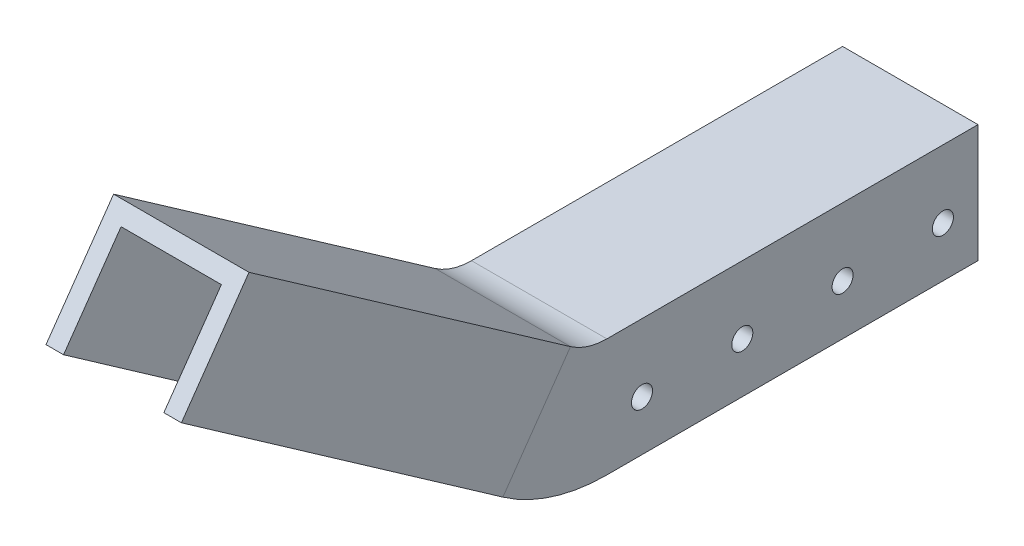
ISO-10303-21;
HEADER;
FILE_DESCRIPTION(('STEP AP214'),'2;1');
FILE_NAME('part.step','',(''),(''),'','','');
FILE_SCHEMA(('AUTOMOTIVE_DESIGN { 1 0 10303 214 1 1 1 1 }'));
ENDSEC;
DATA;
#1=APPLICATION_CONTEXT('core data for automotive mechanical design processes');
#2=APPLICATION_PROTOCOL_DEFINITION('international standard','automotive_design',2000,#1);
#3=PRODUCT_CONTEXT('',#1,'mechanical');
#4=PRODUCT('Part','Part','',(#3));
#5=PRODUCT_RELATED_PRODUCT_CATEGORY('part','',(#4));
#6=PRODUCT_DEFINITION_FORMATION('','',#4);
#7=PRODUCT_DEFINITION_CONTEXT('part definition',#1,'design');
#8=PRODUCT_DEFINITION('design','',#6,#7);
#9=PRODUCT_DEFINITION_SHAPE('','',#8);
#10=(LENGTH_UNIT() NAMED_UNIT(*) SI_UNIT(.MILLI.,.METRE.));
#11=(NAMED_UNIT(*) PLANE_ANGLE_UNIT() SI_UNIT($,.RADIAN.));
#12=(NAMED_UNIT(*) SI_UNIT($,.STERADIAN.) SOLID_ANGLE_UNIT());
#13=UNCERTAINTY_MEASURE_WITH_UNIT(LENGTH_MEASURE(1.E-05),#10,'distance_accuracy_value','');
#14=(GEOMETRIC_REPRESENTATION_CONTEXT(3) GLOBAL_UNCERTAINTY_ASSIGNED_CONTEXT((#13)) GLOBAL_UNIT_ASSIGNED_CONTEXT((#10,
#11,#12)) REPRESENTATION_CONTEXT('',''));
#15=CARTESIAN_POINT('',(0.,0.,0.));
#16=DIRECTION('',(0.,0.,1.));
#17=DIRECTION('',(1.,0.,0.));
#18=AXIS2_PLACEMENT_3D('',#15,#16,#17);
#19=CARTESIAN_POINT('',(0.,0.,-37.));
#20=DIRECTION('',(0.,0.,-1.));
#21=DIRECTION('',(-1.,0.,0.));
#22=AXIS2_PLACEMENT_3D('',#19,#20,#21);
#23=PLANE('',#22);
#24=DIRECTION('',(-1.,0.,0.));
#25=VECTOR('',#24,1.);
#26=CARTESIAN_POINT('',(13.5,-11.5,-37.));
#27=LINE('',#26,#25);
#28=CARTESIAN_POINT('',(-10.,-11.5,-37.));
#29=VERTEX_POINT('',#28);
#30=CARTESIAN_POINT('',(-13.5,-11.5,-37.));
#31=VERTEX_POINT('',#30);
#32=EDGE_CURVE('E55',#29,#31,#27,.T.);
#33=ORIENTED_EDGE('',*,*,#32,.T.);
#34=DIRECTION('',(0.,-1.,0.));
#35=VECTOR('',#34,1.);
#36=CARTESIAN_POINT('',(-13.5,-12.,-37.));
#37=LINE('',#36,#35);
#38=CARTESIAN_POINT('',(-13.5,12.,-37.));
#39=VERTEX_POINT('',#38);
#40=EDGE_CURVE('E166',#39,#31,#37,.T.);
#41=ORIENTED_EDGE('',*,*,#40,.F.);
#42=DIRECTION('',(-1.,0.,0.));
#43=VECTOR('',#42,1.);
#44=CARTESIAN_POINT('',(-13.5,12.,-37.));
#45=LINE('',#44,#43);
#46=CARTESIAN_POINT('',(13.5,12.,-37.));
#47=VERTEX_POINT('',#46);
#48=EDGE_CURVE('E151',#47,#39,#45,.T.);
#49=ORIENTED_EDGE('',*,*,#48,.F.);
#50=DIRECTION('',(0.,1.,0.));
#51=VECTOR('',#50,1.);
#52=CARTESIAN_POINT('',(13.5,-12.,-37.));
#53=LINE('',#52,#51);
#54=CARTESIAN_POINT('',(13.5,-11.5,-37.));
#55=VERTEX_POINT('',#54);
#56=EDGE_CURVE('E310',#55,#47,#53,.T.);
#57=ORIENTED_EDGE('',*,*,#56,.F.);
#58=CARTESIAN_POINT('',(10.,-11.5,-37.));
#59=VERTEX_POINT('',#58);
#60=EDGE_CURVE('E260',#55,#59,#27,.T.);
#61=ORIENTED_EDGE('',*,*,#60,.T.);
#62=DIRECTION('',(0.,1.,0.));
#63=VECTOR('',#62,1.);
#64=CARTESIAN_POINT('',(10.,0.,-37.));
#65=LINE('',#64,#63);
#66=CARTESIAN_POINT('',(10.,8.5,-37.));
#67=VERTEX_POINT('',#66);
#68=EDGE_CURVE('E306',#59,#67,#65,.T.);
#69=ORIENTED_EDGE('',*,*,#68,.T.);
#70=DIRECTION('',(-1.,0.,0.));
#71=VECTOR('',#70,1.);
#72=CARTESIAN_POINT('',(0.,8.5,-37.));
#73=LINE('',#72,#71);
#74=CARTESIAN_POINT('',(-10.,8.5,-37.));
#75=VERTEX_POINT('',#74);
#76=EDGE_CURVE('E316',#67,#75,#73,.T.);
#77=ORIENTED_EDGE('',*,*,#76,.T.);
#78=DIRECTION('',(0.,-1.,0.));
#79=VECTOR('',#78,1.);
#80=CARTESIAN_POINT('',(-10.,0.,-37.));
#81=LINE('',#80,#79);
#82=EDGE_CURVE('E318',#75,#29,#81,.T.);
#83=ORIENTED_EDGE('',*,*,#82,.T.);
#84=EDGE_LOOP('',(#33,#41,#49,#57,#61,#69,#77,#83));
#85=FACE_BOUND('',#84,.T.);
#86=ADVANCED_FACE('F33',(#85),#23,.T.);
#87=CARTESIAN_POINT('',(13.5,-12.,37.));
#88=DIRECTION('',(-1.,0.,0.));
#89=DIRECTION('',(0.,0.,1.));
#90=AXIS2_PLACEMENT_3D('',#87,#88,#89);
#91=PLANE('',#90);
#92=CARTESIAN_POINT('',(13.5,-1.5,-30.));
#93=DIRECTION('',(-1.,0.,0.));
#94=DIRECTION('',(0.,0.,1.));
#95=AXIS2_PLACEMENT_3D('',#92,#93,#94);
#96=CIRCLE('',#95,2.1);
#97=CARTESIAN_POINT('',(13.5,-1.5,-27.9));
#98=VERTEX_POINT('',#97);
#99=EDGE_CURVE('E267',#98,#98,#96,.T.);
#100=ORIENTED_EDGE('',*,*,#99,.T.);
#101=EDGE_LOOP('',(#100));
#102=FACE_BOUND('',#101,.T.);
#103=CARTESIAN_POINT('',(13.5,-1.5,-10.));
#104=DIRECTION('',(-1.,0.,0.));
#105=DIRECTION('',(0.,0.,1.));
#106=AXIS2_PLACEMENT_3D('',#103,#104,#105);
#107=CIRCLE('',#106,2.1);
#108=CARTESIAN_POINT('',(13.5,-1.5,-7.9));
#109=VERTEX_POINT('',#108);
#110=EDGE_CURVE('E274',#109,#109,#107,.T.);
#111=ORIENTED_EDGE('',*,*,#110,.T.);
#112=EDGE_LOOP('',(#111));
#113=FACE_BOUND('',#112,.T.);
#114=CARTESIAN_POINT('',(13.5,-1.5,10.));
#115=DIRECTION('',(-1.,0.,0.));
#116=DIRECTION('',(0.,0.,1.));
#117=AXIS2_PLACEMENT_3D('',#114,#115,#116);
#118=CIRCLE('',#117,2.1);
#119=CARTESIAN_POINT('',(13.5,-1.5,12.1));
#120=VERTEX_POINT('',#119);
#121=EDGE_CURVE('E280',#120,#120,#118,.T.);
#122=ORIENTED_EDGE('',*,*,#121,.T.);
#123=EDGE_LOOP('',(#122));
#124=FACE_BOUND('',#123,.T.);
#125=CARTESIAN_POINT('',(13.5,-1.5,30.));
#126=DIRECTION('',(-1.,0.,0.));
#127=DIRECTION('',(0.,0.,1.));
#128=AXIS2_PLACEMENT_3D('',#125,#126,#127);
#129=CIRCLE('',#128,2.1);
#130=CARTESIAN_POINT('',(13.5,-1.5,32.1));
#131=VERTEX_POINT('',#130);
#132=EDGE_CURVE('E286',#131,#131,#129,.T.);
#133=ORIENTED_EDGE('',*,*,#132,.T.);
#134=EDGE_LOOP('',(#133));
#135=FACE_BOUND('',#134,.T.);
#136=DIRECTION('',(0.,0.,-1.));
#137=VECTOR('',#136,1.);
#138=CARTESIAN_POINT('',(13.5,12.,37.));
#139=LINE('',#138,#137);
#140=CARTESIAN_POINT('',(13.5,12.,37.));
#141=VERTEX_POINT('',#140);
#142=EDGE_CURVE('E41',#141,#47,#139,.T.);
#143=ORIENTED_EDGE('',*,*,#142,.F.);
#144=CARTESIAN_POINT('',(13.5,24.6517019343164,37.));
#145=DIRECTION('',(-1.,0.,0.));
#146=DIRECTION('',(0.,-1.,0.));
#147=AXIS2_PLACEMENT_3D('',#144,#145,#146);
#148=CIRCLE('',#147,12.6517019343164);
#149=CARTESIAN_POINT('',(13.5,14.2880344310861,44.2567181092609));
#150=VERTEX_POINT('',#149);
#151=EDGE_CURVE('E165',#141,#150,#148,.T.);
#152=ORIENTED_EDGE('',*,*,#151,.T.);
#153=DIRECTION('',(0.,0.819152044288991,-0.573576436351047));
#154=VECTOR('',#153,1.);
#155=CARTESIAN_POINT('',(13.5,-4.96203860970515,57.7357643635105));
#156=LINE('',#155,#154);
#157=CARTESIAN_POINT('',(13.5,-4.96203860970515,57.7357643635105));
#158=VERTEX_POINT('',#157);
#159=EDGE_CURVE('E188',#158,#150,#156,.T.);
#160=ORIENTED_EDGE('',*,*,#159,.F.);
#161=CARTESIAN_POINT('',(13.5,24.6517019343164,37.));
#162=DIRECTION('',(-1.,0.,0.));
#163=DIRECTION('',(0.,-1.,0.));
#164=AXIS2_PLACEMENT_3D('',#161,#162,#163);
#165=CIRCLE('',#164,36.1517019343164);
#166=CARTESIAN_POINT('',(13.5,-11.5,37.));
#167=VERTEX_POINT('',#166);
#168=EDGE_CURVE('E243',#167,#158,#165,.T.);
#169=ORIENTED_EDGE('',*,*,#168,.F.);
#170=DIRECTION('',(0.,0.,-1.));
#171=VECTOR('',#170,1.);
#172=CARTESIAN_POINT('',(13.5,-11.5,-37.));
#173=LINE('',#172,#171);
#174=EDGE_CURVE('E255',#167,#55,#173,.T.);
#175=ORIENTED_EDGE('',*,*,#174,.T.);
#176=ORIENTED_EDGE('',*,*,#56,.T.);
#177=EDGE_LOOP('',(#143,#152,#160,#169,#175,#176));
#178=FACE_BOUND('',#177,.T.);
#179=ADVANCED_FACE('F35',(#102,#113,#124,#135,#178),#91,.F.);
#180=CARTESIAN_POINT('',(-13.5,12.,37.));
#181=DIRECTION('',(0.,-1.,0.));
#182=DIRECTION('',(0.,0.,-1.));
#183=AXIS2_PLACEMENT_3D('',#180,#181,#182);
#184=PLANE('',#183);
#185=ORIENTED_EDGE('',*,*,#48,.T.);
#186=DIRECTION('',(0.,0.,-1.));
#187=VECTOR('',#186,1.);
#188=CARTESIAN_POINT('',(-13.5,12.,37.));
#189=LINE('',#188,#187);
#190=CARTESIAN_POINT('',(-13.5,12.,37.));
#191=VERTEX_POINT('',#190);
#192=EDGE_CURVE('E144',#191,#39,#189,.T.);
#193=ORIENTED_EDGE('',*,*,#192,.F.);
#194=DIRECTION('',(-1.,0.,0.));
#195=VECTOR('',#194,1.);
#196=CARTESIAN_POINT('',(-13.5,12.,37.));
#197=LINE('',#196,#195);
#198=EDGE_CURVE('E148',#141,#191,#197,.T.);
#199=ORIENTED_EDGE('',*,*,#198,.F.);
#200=ORIENTED_EDGE('',*,*,#142,.T.);
#201=EDGE_LOOP('',(#185,#193,#199,#200));
#202=FACE_BOUND('',#201,.T.);
#203=ADVANCED_FACE('F146',(#202),#184,.F.);
#204=CARTESIAN_POINT('',(-13.5,-12.,37.));
#205=DIRECTION('',(1.,0.,0.));
#206=DIRECTION('',(0.,0.,-1.));
#207=AXIS2_PLACEMENT_3D('',#204,#205,#206);
#208=PLANE('',#207);
#209=CARTESIAN_POINT('',(-13.5,-1.5,-30.));
#210=DIRECTION('',(-1.,0.,0.));
#211=DIRECTION('',(0.,0.,1.));
#212=AXIS2_PLACEMENT_3D('',#209,#210,#211);
#213=CIRCLE('',#212,2.1);
#214=CARTESIAN_POINT('',(-13.5,-1.5,-27.9));
#215=VERTEX_POINT('',#214);
#216=EDGE_CURVE('E271',#215,#215,#213,.T.);
#217=ORIENTED_EDGE('',*,*,#216,.F.);
#218=EDGE_LOOP('',(#217));
#219=FACE_BOUND('',#218,.T.);
#220=CARTESIAN_POINT('',(-13.5,-1.5,-10.));
#221=DIRECTION('',(-1.,0.,0.));
#222=DIRECTION('',(0.,0.,1.));
#223=AXIS2_PLACEMENT_3D('',#220,#221,#222);
#224=CIRCLE('',#223,2.1);
#225=CARTESIAN_POINT('',(-13.5,-1.5,-7.9));
#226=VERTEX_POINT('',#225);
#227=EDGE_CURVE('E277',#226,#226,#224,.T.);
#228=ORIENTED_EDGE('',*,*,#227,.F.);
#229=EDGE_LOOP('',(#228));
#230=FACE_BOUND('',#229,.T.);
#231=CARTESIAN_POINT('',(-13.5,-1.5,10.));
#232=DIRECTION('',(-1.,0.,0.));
#233=DIRECTION('',(0.,0.,1.));
#234=AXIS2_PLACEMENT_3D('',#231,#232,#233);
#235=CIRCLE('',#234,2.1);
#236=CARTESIAN_POINT('',(-13.5,-1.5,12.1));
#237=VERTEX_POINT('',#236);
#238=EDGE_CURVE('E283',#237,#237,#235,.T.);
#239=ORIENTED_EDGE('',*,*,#238,.F.);
#240=EDGE_LOOP('',(#239));
#241=FACE_BOUND('',#240,.T.);
#242=CARTESIAN_POINT('',(-13.5,-1.5,30.));
#243=DIRECTION('',(-1.,0.,0.));
#244=DIRECTION('',(0.,0.,1.));
#245=AXIS2_PLACEMENT_3D('',#242,#243,#244);
#246=CIRCLE('',#245,2.1);
#247=CARTESIAN_POINT('',(-13.5,-1.5,32.1));
#248=VERTEX_POINT('',#247);
#249=EDGE_CURVE('E266',#248,#248,#246,.T.);
#250=ORIENTED_EDGE('',*,*,#249,.F.);
#251=EDGE_LOOP('',(#250));
#252=FACE_BOUND('',#251,.T.);
#253=ORIENTED_EDGE('',*,*,#40,.T.);
#254=DIRECTION('',(0.,0.,-1.));
#255=VECTOR('',#254,1.);
#256=CARTESIAN_POINT('',(-13.5,-11.5,-37.));
#257=LINE('',#256,#255);
#258=CARTESIAN_POINT('',(-13.5,-11.5,37.));
#259=VERTEX_POINT('',#258);
#260=EDGE_CURVE('E254',#259,#31,#257,.T.);
#261=ORIENTED_EDGE('',*,*,#260,.F.);
#262=CARTESIAN_POINT('',(-13.5,24.6517019343164,37.));
#263=DIRECTION('',(-1.,0.,0.));
#264=DIRECTION('',(0.,-1.,0.));
#265=AXIS2_PLACEMENT_3D('',#262,#263,#264);
#266=CIRCLE('',#265,36.1517019343164);
#267=CARTESIAN_POINT('',(-13.5,-4.96203860970515,57.7357643635105));
#268=VERTEX_POINT('',#267);
#269=EDGE_CURVE('E175',#259,#268,#266,.T.);
#270=ORIENTED_EDGE('',*,*,#269,.T.);
#271=DIRECTION('',(0.,-0.819152044288991,0.573576436351047));
#272=VECTOR('',#271,1.);
#273=CARTESIAN_POINT('',(-13.5,14.2880344310861,44.2567181092609));
#274=LINE('',#273,#272);
#275=CARTESIAN_POINT('',(-13.5,14.2880344310861,44.2567181092609));
#276=VERTEX_POINT('',#275);
#277=EDGE_CURVE('E172',#276,#268,#274,.T.);
#278=ORIENTED_EDGE('',*,*,#277,.F.);
#279=CARTESIAN_POINT('',(-13.5,24.6517019343164,37.));
#280=DIRECTION('',(-1.,0.,0.));
#281=DIRECTION('',(0.,-1.,0.));
#282=AXIS2_PLACEMENT_3D('',#279,#280,#281);
#283=CIRCLE('',#282,12.6517019343164);
#284=EDGE_CURVE('E162',#191,#276,#283,.T.);
#285=ORIENTED_EDGE('',*,*,#284,.F.);
#286=ORIENTED_EDGE('',*,*,#192,.T.);
#287=EDGE_LOOP('',(#253,#261,#270,#278,#285,#286));
#288=FACE_BOUND('',#287,.T.);
#289=ADVANCED_FACE('F169',(#219,#230,#241,#252,#288),#208,.F.);
#290=CARTESIAN_POINT('',(10.,-12.,37.));
#291=DIRECTION('',(-1.,0.,0.));
#292=DIRECTION('',(0.,0.,1.));
#293=AXIS2_PLACEMENT_3D('',#290,#291,#292);
#294=PLANE('',#293);
#295=DIRECTION('',(0.,0.,-1.));
#296=VECTOR('',#295,1.);
#297=CARTESIAN_POINT('',(10.,-11.5,37.));
#298=LINE('',#297,#296);
#299=CARTESIAN_POINT('',(10.,-11.5,37.));
#300=VERTEX_POINT('',#299);
#301=EDGE_CURVE('E263',#300,#59,#298,.T.);
#302=ORIENTED_EDGE('',*,*,#301,.F.);
#303=CARTESIAN_POINT('',(10.,24.6517019343164,37.));
#304=DIRECTION('',(-1.,0.,0.));
#305=DIRECTION('',(0.,-1.,0.));
#306=AXIS2_PLACEMENT_3D('',#303,#304,#305);
#307=CIRCLE('',#306,36.1517019343164);
#308=CARTESIAN_POINT('',(10.,-4.96203860970515,57.7357643635105));
#309=VERTEX_POINT('',#308);
#310=EDGE_CURVE('E232',#300,#309,#307,.T.);
#311=ORIENTED_EDGE('',*,*,#310,.T.);
#312=DIRECTION('',(0.,-0.819152044288991,0.573576436351047));
#313=VECTOR('',#312,1.);
#314=CARTESIAN_POINT('',(10.,11.4210022760747,46.2642356364895));
#315=LINE('',#314,#313);
#316=CARTESIAN_POINT('',(10.,11.4210022760747,46.2642356364895));
#317=VERTEX_POINT('',#316);
#318=EDGE_CURVE('E224',#317,#309,#315,.T.);
#319=ORIENTED_EDGE('',*,*,#318,.F.);
#320=CARTESIAN_POINT('',(10.,24.6517019343164,37.));
#321=DIRECTION('',(-1.,0.,0.));
#322=DIRECTION('',(0.,-1.,0.));
#323=AXIS2_PLACEMENT_3D('',#320,#321,#322);
#324=CIRCLE('',#323,16.1517019343164);
#325=CARTESIAN_POINT('',(10.,8.5,37.));
#326=VERTEX_POINT('',#325);
#327=EDGE_CURVE('E221',#326,#317,#324,.T.);
#328=ORIENTED_EDGE('',*,*,#327,.F.);
#329=DIRECTION('',(0.,0.,-1.));
#330=VECTOR('',#329,1.);
#331=CARTESIAN_POINT('',(10.,8.5,37.));
#332=LINE('',#331,#330);
#333=EDGE_CURVE('E307',#326,#67,#332,.T.);
#334=ORIENTED_EDGE('',*,*,#333,.T.);
#335=ORIENTED_EDGE('',*,*,#68,.F.);
#336=EDGE_LOOP('',(#302,#311,#319,#328,#334,#335));
#337=FACE_BOUND('',#336,.T.);
#338=CARTESIAN_POINT('',(10.,-1.5,-30.));
#339=DIRECTION('',(-1.,0.,0.));
#340=DIRECTION('',(0.,0.,1.));
#341=AXIS2_PLACEMENT_3D('',#338,#339,#340);
#342=CIRCLE('',#341,2.1);
#343=CARTESIAN_POINT('',(10.,-1.5,-27.9));
#344=VERTEX_POINT('',#343);
#345=EDGE_CURVE('E303',#344,#344,#342,.T.);
#346=ORIENTED_EDGE('',*,*,#345,.F.);
#347=EDGE_LOOP('',(#346));
#348=FACE_BOUND('',#347,.T.);
#349=CARTESIAN_POINT('',(10.,-1.5,-10.));
#350=DIRECTION('',(-1.,0.,0.));
#351=DIRECTION('',(0.,0.,1.));
#352=AXIS2_PLACEMENT_3D('',#349,#350,#351);
#353=CIRCLE('',#352,2.1);
#354=CARTESIAN_POINT('',(10.,-1.5,-7.9));
#355=VERTEX_POINT('',#354);
#356=EDGE_CURVE('E299',#355,#355,#353,.T.);
#357=ORIENTED_EDGE('',*,*,#356,.F.);
#358=EDGE_LOOP('',(#357));
#359=FACE_BOUND('',#358,.T.);
#360=CARTESIAN_POINT('',(10.,-1.5,10.));
#361=DIRECTION('',(-1.,0.,0.));
#362=DIRECTION('',(0.,0.,1.));
#363=AXIS2_PLACEMENT_3D('',#360,#361,#362);
#364=CIRCLE('',#363,2.1);
#365=CARTESIAN_POINT('',(10.,-1.5,12.1));
#366=VERTEX_POINT('',#365);
#367=EDGE_CURVE('E295',#366,#366,#364,.T.);
#368=ORIENTED_EDGE('',*,*,#367,.F.);
#369=EDGE_LOOP('',(#368));
#370=FACE_BOUND('',#369,.T.);
#371=CARTESIAN_POINT('',(10.,-1.5,30.));
#372=DIRECTION('',(-1.,0.,0.));
#373=DIRECTION('',(0.,0.,1.));
#374=AXIS2_PLACEMENT_3D('',#371,#372,#373);
#375=CIRCLE('',#374,2.1);
#376=CARTESIAN_POINT('',(10.,-1.5,32.1));
#377=VERTEX_POINT('',#376);
#378=EDGE_CURVE('E291',#377,#377,#375,.T.);
#379=ORIENTED_EDGE('',*,*,#378,.F.);
#380=EDGE_LOOP('',(#379));
#381=FACE_BOUND('',#380,.T.);
#382=ADVANCED_FACE('F359',(#337,#348,#359,#370,#381),#294,.T.);
#383=CARTESIAN_POINT('',(-13.5,8.5,37.));
#384=DIRECTION('',(0.,-1.,0.));
#385=DIRECTION('',(0.,0.,-1.));
#386=AXIS2_PLACEMENT_3D('',#383,#384,#385);
#387=PLANE('',#386);
#388=ORIENTED_EDGE('',*,*,#76,.F.);
#389=ORIENTED_EDGE('',*,*,#333,.F.);
#390=DIRECTION('',(-1.,0.,0.));
#391=VECTOR('',#390,1.);
#392=CARTESIAN_POINT('',(0.,8.5,37.));
#393=LINE('',#392,#391);
#394=CARTESIAN_POINT('',(-10.,8.5,37.));
#395=VERTEX_POINT('',#394);
#396=EDGE_CURVE('E314',#326,#395,#393,.T.);
#397=ORIENTED_EDGE('',*,*,#396,.T.);
#398=DIRECTION('',(0.,0.,-1.));
#399=VECTOR('',#398,1.);
#400=CARTESIAN_POINT('',(-10.,8.5,37.));
#401=LINE('',#400,#399);
#402=EDGE_CURVE('E311',#395,#75,#401,.T.);
#403=ORIENTED_EDGE('',*,*,#402,.T.);
#404=EDGE_LOOP('',(#388,#389,#397,#403));
#405=FACE_BOUND('',#404,.T.);
#406=ADVANCED_FACE('F342',(#405),#387,.T.);
#407=CARTESIAN_POINT('',(-10.,-12.,37.));
#408=DIRECTION('',(1.,0.,0.));
#409=DIRECTION('',(0.,0.,-1.));
#410=AXIS2_PLACEMENT_3D('',#407,#408,#409);
#411=PLANE('',#410);
#412=DIRECTION('',(0.,0.,1.));
#413=VECTOR('',#412,1.);
#414=CARTESIAN_POINT('',(-10.,-11.5,37.));
#415=LINE('',#414,#413);
#416=CARTESIAN_POINT('',(-10.,-11.5,37.));
#417=VERTEX_POINT('',#416);
#418=EDGE_CURVE('E11',#29,#417,#415,.T.);
#419=ORIENTED_EDGE('',*,*,#418,.F.);
#420=ORIENTED_EDGE('',*,*,#82,.F.);
#421=ORIENTED_EDGE('',*,*,#402,.F.);
#422=CARTESIAN_POINT('',(-10.,24.6517019343164,37.));
#423=DIRECTION('',(-1.,0.,0.));
#424=DIRECTION('',(0.,-1.,0.));
#425=AXIS2_PLACEMENT_3D('',#422,#423,#424);
#426=CIRCLE('',#425,16.1517019343164);
#427=CARTESIAN_POINT('',(-10.,11.4210022760747,46.2642356364895));
#428=VERTEX_POINT('',#427);
#429=EDGE_CURVE('E210',#395,#428,#426,.T.);
#430=ORIENTED_EDGE('',*,*,#429,.T.);
#431=DIRECTION('',(0.,0.819152044288991,-0.573576436351047));
#432=VECTOR('',#431,1.);
#433=CARTESIAN_POINT('',(-10.,-4.96203860970515,57.7357643635105));
#434=LINE('',#433,#432);
#435=CARTESIAN_POINT('',(-10.,-4.96203860970515,57.7357643635105));
#436=VERTEX_POINT('',#435);
#437=EDGE_CURVE('E202',#436,#428,#434,.T.);
#438=ORIENTED_EDGE('',*,*,#437,.F.);
#439=CARTESIAN_POINT('',(-10.,24.6517019343164,37.));
#440=DIRECTION('',(-1.,0.,0.));
#441=DIRECTION('',(0.,-1.,0.));
#442=AXIS2_PLACEMENT_3D('',#439,#440,#441);
#443=CIRCLE('',#442,36.1517019343164);
#444=EDGE_CURVE('E199',#417,#436,#443,.T.);
#445=ORIENTED_EDGE('',*,*,#444,.F.);
#446=EDGE_LOOP('',(#419,#420,#421,#430,#438,#445));
#447=FACE_BOUND('',#446,.T.);
#448=CARTESIAN_POINT('',(-10.,-1.5,-30.));
#449=DIRECTION('',(1.,0.,0.));
#450=DIRECTION('',(0.,0.,-1.));
#451=AXIS2_PLACEMENT_3D('',#448,#449,#450);
#452=CIRCLE('',#451,2.1);
#453=CARTESIAN_POINT('',(-10.,-1.5,-32.1));
#454=VERTEX_POINT('',#453);
#455=EDGE_CURVE('E302',#454,#454,#452,.T.);
#456=ORIENTED_EDGE('',*,*,#455,.F.);
#457=EDGE_LOOP('',(#456));
#458=FACE_BOUND('',#457,.T.);
#459=CARTESIAN_POINT('',(-10.,-1.5,-10.));
#460=DIRECTION('',(1.,0.,0.));
#461=DIRECTION('',(0.,0.,-1.));
#462=AXIS2_PLACEMENT_3D('',#459,#460,#461);
#463=CIRCLE('',#462,2.1);
#464=CARTESIAN_POINT('',(-10.,-1.5,-12.1));
#465=VERTEX_POINT('',#464);
#466=EDGE_CURVE('E298',#465,#465,#463,.T.);
#467=ORIENTED_EDGE('',*,*,#466,.F.);
#468=EDGE_LOOP('',(#467));
#469=FACE_BOUND('',#468,.T.);
#470=CARTESIAN_POINT('',(-10.,-1.5,10.));
#471=DIRECTION('',(1.,0.,0.));
#472=DIRECTION('',(0.,0.,-1.));
#473=AXIS2_PLACEMENT_3D('',#470,#471,#472);
#474=CIRCLE('',#473,2.1);
#475=CARTESIAN_POINT('',(-10.,-1.5,7.9));
#476=VERTEX_POINT('',#475);
#477=EDGE_CURVE('E294',#476,#476,#474,.T.);
#478=ORIENTED_EDGE('',*,*,#477,.F.);
#479=EDGE_LOOP('',(#478));
#480=FACE_BOUND('',#479,.T.);
#481=CARTESIAN_POINT('',(-10.,-1.5,30.));
#482=DIRECTION('',(1.,0.,0.));
#483=DIRECTION('',(0.,0.,-1.));
#484=AXIS2_PLACEMENT_3D('',#481,#482,#483);
#485=CIRCLE('',#484,2.1);
#486=CARTESIAN_POINT('',(-10.,-1.5,27.9));
#487=VERTEX_POINT('',#486);
#488=EDGE_CURVE('E270',#487,#487,#485,.T.);
#489=ORIENTED_EDGE('',*,*,#488,.F.);
#490=EDGE_LOOP('',(#489));
#491=FACE_BOUND('',#490,.T.);
#492=ADVANCED_FACE('F338',(#447,#458,#469,#480,#491),#411,.T.);
#493=CARTESIAN_POINT('',(13.5,-1.5,30.));
#494=DIRECTION('',(-1.,0.,0.));
#495=DIRECTION('',(0.,0.,1.));
#496=AXIS2_PLACEMENT_3D('',#493,#494,#495);
#497=CYLINDRICAL_SURFACE('',#496,2.1);
#498=ORIENTED_EDGE('',*,*,#488,.T.);
#499=EDGE_LOOP('',(#498));
#500=FACE_BOUND('',#499,.T.);
#501=ORIENTED_EDGE('',*,*,#249,.T.);
#502=EDGE_LOOP('',(#501));
#503=FACE_BOUND('',#502,.T.);
#504=ADVANCED_FACE('F341',(#500,#503),#497,.F.);
#505=CARTESIAN_POINT('',(13.5,-1.5,10.));
#506=DIRECTION('',(-1.,0.,0.));
#507=DIRECTION('',(0.,0.,1.));
#508=AXIS2_PLACEMENT_3D('',#505,#506,#507);
#509=CYLINDRICAL_SURFACE('',#508,2.1);
#510=ORIENTED_EDGE('',*,*,#477,.T.);
#511=EDGE_LOOP('',(#510));
#512=FACE_BOUND('',#511,.T.);
#513=ORIENTED_EDGE('',*,*,#238,.T.);
#514=EDGE_LOOP('',(#513));
#515=FACE_BOUND('',#514,.T.);
#516=ADVANCED_FACE('F353',(#512,#515),#509,.F.);
#517=CARTESIAN_POINT('',(13.5,-1.5,-10.));
#518=DIRECTION('',(-1.,0.,0.));
#519=DIRECTION('',(0.,0.,1.));
#520=AXIS2_PLACEMENT_3D('',#517,#518,#519);
#521=CYLINDRICAL_SURFACE('',#520,2.1);
#522=ORIENTED_EDGE('',*,*,#466,.T.);
#523=EDGE_LOOP('',(#522));
#524=FACE_BOUND('',#523,.T.);
#525=ORIENTED_EDGE('',*,*,#227,.T.);
#526=EDGE_LOOP('',(#525));
#527=FACE_BOUND('',#526,.T.);
#528=ADVANCED_FACE('F383',(#524,#527),#521,.F.);
#529=CARTESIAN_POINT('',(13.5,-1.5,-30.));
#530=DIRECTION('',(-1.,0.,0.));
#531=DIRECTION('',(0.,0.,1.));
#532=AXIS2_PLACEMENT_3D('',#529,#530,#531);
#533=CYLINDRICAL_SURFACE('',#532,2.1);
#534=ORIENTED_EDGE('',*,*,#455,.T.);
#535=EDGE_LOOP('',(#534));
#536=FACE_BOUND('',#535,.T.);
#537=ORIENTED_EDGE('',*,*,#216,.T.);
#538=EDGE_LOOP('',(#537));
#539=FACE_BOUND('',#538,.T.);
#540=ADVANCED_FACE('F335',(#536,#539),#533,.F.);
#541=ORIENTED_EDGE('',*,*,#378,.T.);
#542=EDGE_LOOP('',(#541));
#543=FACE_BOUND('',#542,.T.);
#544=ORIENTED_EDGE('',*,*,#132,.F.);
#545=EDGE_LOOP('',(#544));
#546=FACE_BOUND('',#545,.T.);
#547=ADVANCED_FACE('F355',(#543,#546),#497,.F.);
#548=ORIENTED_EDGE('',*,*,#367,.T.);
#549=EDGE_LOOP('',(#548));
#550=FACE_BOUND('',#549,.T.);
#551=ORIENTED_EDGE('',*,*,#121,.F.);
#552=EDGE_LOOP('',(#551));
#553=FACE_BOUND('',#552,.T.);
#554=ADVANCED_FACE('F385',(#550,#553),#509,.F.);
#555=ORIENTED_EDGE('',*,*,#356,.T.);
#556=EDGE_LOOP('',(#555));
#557=FACE_BOUND('',#556,.T.);
#558=ORIENTED_EDGE('',*,*,#110,.F.);
#559=EDGE_LOOP('',(#558));
#560=FACE_BOUND('',#559,.T.);
#561=ADVANCED_FACE('F389',(#557,#560),#521,.F.);
#562=ORIENTED_EDGE('',*,*,#345,.T.);
#563=EDGE_LOOP('',(#562));
#564=FACE_BOUND('',#563,.T.);
#565=ORIENTED_EDGE('',*,*,#99,.F.);
#566=EDGE_LOOP('',(#565));
#567=FACE_BOUND('',#566,.T.);
#568=ADVANCED_FACE('F392',(#564,#567),#533,.F.);
#569=CARTESIAN_POINT('',(13.5,-11.5,-37.));
#570=DIRECTION('',(0.,1.,0.));
#571=DIRECTION('',(0.,0.,1.));
#572=AXIS2_PLACEMENT_3D('',#569,#570,#571);
#573=PLANE('',#572);
#574=ORIENTED_EDGE('',*,*,#418,.T.);
#575=DIRECTION('',(-1.,0.,0.));
#576=VECTOR('',#575,1.);
#577=CARTESIAN_POINT('',(13.5,-11.5,37.));
#578=LINE('',#577,#576);
#579=EDGE_CURVE('E258',#417,#259,#578,.T.);
#580=ORIENTED_EDGE('',*,*,#579,.T.);
#581=ORIENTED_EDGE('',*,*,#260,.T.);
#582=ORIENTED_EDGE('',*,*,#32,.F.);
#583=EDGE_LOOP('',(#574,#580,#581,#582));
#584=FACE_BOUND('',#583,.T.);
#585=ADVANCED_FACE('F393',(#584),#573,.F.);
#586=ORIENTED_EDGE('',*,*,#301,.T.);
#587=ORIENTED_EDGE('',*,*,#60,.F.);
#588=ORIENTED_EDGE('',*,*,#174,.F.);
#589=EDGE_CURVE('E48',#167,#300,#578,.T.);
#590=ORIENTED_EDGE('',*,*,#589,.T.);
#591=EDGE_LOOP('',(#586,#587,#588,#590));
#592=FACE_BOUND('',#591,.T.);
#593=ADVANCED_FACE('F396',(#592),#573,.F.);
#594=CARTESIAN_POINT('',(0.,49.3433573299453,115.242269180421));
#595=DIRECTION('',(0.,0.573576436351047,0.819152044288991));
#596=DIRECTION('',(1.,0.,0.));
#597=AXIS2_PLACEMENT_3D('',#594,#595,#596);
#598=PLANE('',#597);
#599=DIRECTION('',(-1.,0.,0.));
#600=VECTOR('',#599,1.);
#601=CARTESIAN_POINT('',(13.5,59.1731818614132,108.359351944208));
#602=LINE('',#601,#600);
#603=CARTESIAN_POINT('',(13.5,59.1731818614132,108.359351944208));
#604=VERTEX_POINT('',#603);
#605=CARTESIAN_POINT('',(-13.5,59.1731818614132,108.359351944208));
#606=VERTEX_POINT('',#605);
#607=EDGE_CURVE('E180',#604,#606,#602,.T.);
#608=ORIENTED_EDGE('',*,*,#607,.T.);
#609=DIRECTION('',(0.,-0.819152044288991,0.573576436351047));
#610=VECTOR('',#609,1.);
#611=CARTESIAN_POINT('',(-13.5,59.1731818614132,108.359351944208));
#612=LINE('',#611,#610);
#613=CARTESIAN_POINT('',(-13.5,39.9231088206219,121.838398198458));
#614=VERTEX_POINT('',#613);
#615=EDGE_CURVE('E186',#606,#614,#612,.T.);
#616=ORIENTED_EDGE('',*,*,#615,.T.);
#617=DIRECTION('',(1.,0.,0.));
#618=VECTOR('',#617,1.);
#619=CARTESIAN_POINT('',(-13.5,39.9231088206219,121.838398198458));
#620=LINE('',#619,#618);
#621=CARTESIAN_POINT('',(-10.,39.9231088206219,121.838398198458));
#622=VERTEX_POINT('',#621);
#623=EDGE_CURVE('E196',#614,#622,#620,.T.);
#624=ORIENTED_EDGE('',*,*,#623,.T.);
#625=DIRECTION('',(0.,0.819152044288991,-0.573576436351047));
#626=VECTOR('',#625,1.);
#627=CARTESIAN_POINT('',(-10.,39.9231088206219,121.838398198458));
#628=LINE('',#627,#626);
#629=CARTESIAN_POINT('',(-10.,56.3061497064018,110.366869471437));
#630=VERTEX_POINT('',#629);
#631=EDGE_CURVE('E207',#622,#630,#628,.T.);
#632=ORIENTED_EDGE('',*,*,#631,.T.);
#633=DIRECTION('',(1.,0.,0.));
#634=VECTOR('',#633,1.);
#635=CARTESIAN_POINT('',(-10.,56.3061497064018,110.366869471437));
#636=LINE('',#635,#634);
#637=CARTESIAN_POINT('',(10.,56.3061497064018,110.366869471437));
#638=VERTEX_POINT('',#637);
#639=EDGE_CURVE('E218',#630,#638,#636,.T.);
#640=ORIENTED_EDGE('',*,*,#639,.T.);
#641=DIRECTION('',(0.,-0.819152044288991,0.573576436351047));
#642=VECTOR('',#641,1.);
#643=CARTESIAN_POINT('',(10.,56.3061497064018,110.366869471437));
#644=LINE('',#643,#642);
#645=CARTESIAN_POINT('',(10.,39.9231088206219,121.838398198458));
#646=VERTEX_POINT('',#645);
#647=EDGE_CURVE('E229',#638,#646,#644,.T.);
#648=ORIENTED_EDGE('',*,*,#647,.T.);
#649=DIRECTION('',(1.,0.,0.));
#650=VECTOR('',#649,1.);
#651=CARTESIAN_POINT('',(10.,39.9231088206219,121.838398198458));
#652=LINE('',#651,#650);
#653=CARTESIAN_POINT('',(13.5,39.9231088206219,121.838398198458));
#654=VERTEX_POINT('',#653);
#655=EDGE_CURVE('E240',#646,#654,#652,.T.);
#656=ORIENTED_EDGE('',*,*,#655,.T.);
#657=DIRECTION('',(0.,0.819152044288991,-0.573576436351047));
#658=VECTOR('',#657,1.);
#659=CARTESIAN_POINT('',(13.5,39.9231088206219,121.838398198458));
#660=LINE('',#659,#658);
#661=EDGE_CURVE('E250',#654,#604,#660,.T.);
#662=ORIENTED_EDGE('',*,*,#661,.T.);
#663=EDGE_LOOP('',(#608,#616,#624,#632,#640,#648,#656,#662));
#664=FACE_BOUND('',#663,.T.);
#665=ADVANCED_FACE('F397',(#664),#598,.T.);
#666=CARTESIAN_POINT('',(0.,24.6517019343164,37.));
#667=DIRECTION('',(-1.,0.,0.));
#668=DIRECTION('',(0.,0.,1.));
#669=AXIS2_PLACEMENT_3D('',#666,#667,#668);
#670=CYLINDRICAL_SURFACE('',#669,12.6517019343164);
#671=ORIENTED_EDGE('',*,*,#284,.T.);
#672=DIRECTION('',(-1.,0.,0.));
#673=VECTOR('',#672,1.);
#674=CARTESIAN_POINT('',(13.5,14.2880344310861,44.2567181092609));
#675=LINE('',#674,#673);
#676=EDGE_CURVE('E173',#150,#276,#675,.T.);
#677=ORIENTED_EDGE('',*,*,#676,.F.);
#678=ORIENTED_EDGE('',*,*,#151,.F.);
#679=ORIENTED_EDGE('',*,*,#198,.T.);
#680=EDGE_LOOP('',(#671,#677,#678,#679));
#681=FACE_BOUND('',#680,.T.);
#682=ADVANCED_FACE('F160',(#681),#670,.F.);
#683=CARTESIAN_POINT('',(0.,24.6517019343164,37.));
#684=DIRECTION('',(-1.,0.,0.));
#685=DIRECTION('',(0.,0.,1.));
#686=AXIS2_PLACEMENT_3D('',#683,#684,#685);
#687=CYLINDRICAL_SURFACE('',#686,36.1517019343164);
#688=ORIENTED_EDGE('',*,*,#444,.T.);
#689=DIRECTION('',(1.,0.,0.));
#690=VECTOR('',#689,1.);
#691=CARTESIAN_POINT('',(-13.5,-4.96203860970515,57.7357643635105));
#692=LINE('',#691,#690);
#693=EDGE_CURVE('E191',#268,#436,#692,.T.);
#694=ORIENTED_EDGE('',*,*,#693,.F.);
#695=ORIENTED_EDGE('',*,*,#269,.F.);
#696=ORIENTED_EDGE('',*,*,#579,.F.);
#697=EDGE_LOOP('',(#688,#694,#695,#696));
#698=FACE_BOUND('',#697,.T.);
#699=ADVANCED_FACE('F426',(#698),#687,.T.);
#700=CARTESIAN_POINT('',(0.,24.6517019343164,37.));
#701=DIRECTION('',(-1.,0.,0.));
#702=DIRECTION('',(0.,0.,1.));
#703=AXIS2_PLACEMENT_3D('',#700,#701,#702);
#704=CYLINDRICAL_SURFACE('',#703,16.1517019343164);
#705=ORIENTED_EDGE('',*,*,#327,.T.);
#706=DIRECTION('',(1.,0.,0.));
#707=VECTOR('',#706,1.);
#708=CARTESIAN_POINT('',(-10.,11.4210022760747,46.2642356364895));
#709=LINE('',#708,#707);
#710=EDGE_CURVE('E213',#428,#317,#709,.T.);
#711=ORIENTED_EDGE('',*,*,#710,.F.);
#712=ORIENTED_EDGE('',*,*,#429,.F.);
#713=ORIENTED_EDGE('',*,*,#396,.F.);
#714=EDGE_LOOP('',(#705,#711,#712,#713));
#715=FACE_BOUND('',#714,.T.);
#716=ADVANCED_FACE('F414',(#715),#704,.T.);
#717=CARTESIAN_POINT('',(0.,24.6517019343164,37.));
#718=DIRECTION('',(-1.,0.,0.));
#719=DIRECTION('',(0.,0.,1.));
#720=AXIS2_PLACEMENT_3D('',#717,#718,#719);
#721=CYLINDRICAL_SURFACE('',#720,36.1517019343164);
#722=ORIENTED_EDGE('',*,*,#168,.T.);
#723=DIRECTION('',(1.,0.,0.));
#724=VECTOR('',#723,1.);
#725=CARTESIAN_POINT('',(10.,-4.96203860970515,57.7357643635105));
#726=LINE('',#725,#724);
#727=EDGE_CURVE('E235',#309,#158,#726,.T.);
#728=ORIENTED_EDGE('',*,*,#727,.F.);
#729=ORIENTED_EDGE('',*,*,#310,.F.);
#730=ORIENTED_EDGE('',*,*,#589,.F.);
#731=EDGE_LOOP('',(#722,#728,#729,#730));
#732=FACE_BOUND('',#731,.T.);
#733=ADVANCED_FACE('F410',(#732),#721,.T.);
#734=CARTESIAN_POINT('',(13.5,14.2880344310861,44.2567181092609));
#735=DIRECTION('',(0.,0.819152044288991,-0.573576436351046));
#736=DIRECTION('',(0.,0.573576436351046,0.819152044288991));
#737=AXIS2_PLACEMENT_3D('',#734,#735,#736);
#738=PLANE('',#737);
#739=DIRECTION('',(0.,0.573576436351046,0.819152044288991));
#740=VECTOR('',#739,1.);
#741=CARTESIAN_POINT('',(-13.5,14.2880344310861,44.2567181092609));
#742=LINE('',#741,#740);
#743=EDGE_CURVE('E182',#276,#606,#742,.T.);
#744=ORIENTED_EDGE('',*,*,#743,.T.);
#745=ORIENTED_EDGE('',*,*,#607,.F.);
#746=DIRECTION('',(0.,0.573576436351046,0.819152044288991));
#747=VECTOR('',#746,1.);
#748=CARTESIAN_POINT('',(13.5,14.2880344310861,44.2567181092609));
#749=LINE('',#748,#747);
#750=EDGE_CURVE('E183',#150,#604,#749,.T.);
#751=ORIENTED_EDGE('',*,*,#750,.F.);
#752=ORIENTED_EDGE('',*,*,#676,.T.);
#753=EDGE_LOOP('',(#744,#745,#751,#752));
#754=FACE_BOUND('',#753,.T.);
#755=ADVANCED_FACE('F413',(#754),#738,.T.);
#756=CARTESIAN_POINT('',(-13.5,14.2880344310861,44.2567181092609));
#757=DIRECTION('',(-1.,0.,0.));
#758=DIRECTION('',(0.,0.,1.));
#759=AXIS2_PLACEMENT_3D('',#756,#757,#758);
#760=PLANE('',#759);
#761=DIRECTION('',(0.,0.573576436351046,0.819152044288991));
#762=VECTOR('',#761,1.);
#763=CARTESIAN_POINT('',(-13.5,-4.96203860970515,57.7357643635105));
#764=LINE('',#763,#762);
#765=EDGE_CURVE('E193',#268,#614,#764,.T.);
#766=ORIENTED_EDGE('',*,*,#765,.T.);
#767=ORIENTED_EDGE('',*,*,#615,.F.);
#768=ORIENTED_EDGE('',*,*,#743,.F.);
#769=ORIENTED_EDGE('',*,*,#277,.T.);
#770=EDGE_LOOP('',(#766,#767,#768,#769));
#771=FACE_BOUND('',#770,.T.);
#772=ADVANCED_FACE('F434',(#771),#760,.T.);
#773=CARTESIAN_POINT('',(-13.5,-4.96203860970515,57.7357643635105));
#774=DIRECTION('',(0.,-0.819152044288992,0.573576436351046));
#775=DIRECTION('',(0.,-0.573576436351046,-0.819152044288992));
#776=AXIS2_PLACEMENT_3D('',#773,#774,#775);
#777=PLANE('',#776);
#778=DIRECTION('',(0.,0.573576436351046,0.819152044288991));
#779=VECTOR('',#778,1.);
#780=CARTESIAN_POINT('',(-10.,-4.96203860970515,57.7357643635105));
#781=LINE('',#780,#779);
#782=EDGE_CURVE('E204',#436,#622,#781,.T.);
#783=ORIENTED_EDGE('',*,*,#782,.T.);
#784=ORIENTED_EDGE('',*,*,#623,.F.);
#785=ORIENTED_EDGE('',*,*,#765,.F.);
#786=ORIENTED_EDGE('',*,*,#693,.T.);
#787=EDGE_LOOP('',(#783,#784,#785,#786));
#788=FACE_BOUND('',#787,.T.);
#789=ADVANCED_FACE('F430',(#788),#777,.T.);
#790=CARTESIAN_POINT('',(-10.,-4.96203860970515,57.7357643635105));
#791=DIRECTION('',(1.,0.,0.));
#792=DIRECTION('',(0.,0.,-1.));
#793=AXIS2_PLACEMENT_3D('',#790,#791,#792);
#794=PLANE('',#793);
#795=DIRECTION('',(0.,0.573576436351046,0.819152044288991));
#796=VECTOR('',#795,1.);
#797=CARTESIAN_POINT('',(-10.,11.4210022760747,46.2642356364895));
#798=LINE('',#797,#796);
#799=EDGE_CURVE('E215',#428,#630,#798,.T.);
#800=ORIENTED_EDGE('',*,*,#799,.T.);
#801=ORIENTED_EDGE('',*,*,#631,.F.);
#802=ORIENTED_EDGE('',*,*,#782,.F.);
#803=ORIENTED_EDGE('',*,*,#437,.T.);
#804=EDGE_LOOP('',(#800,#801,#802,#803));
#805=FACE_BOUND('',#804,.T.);
#806=ADVANCED_FACE('F422',(#805),#794,.T.);
#807=CARTESIAN_POINT('',(-10.,11.4210022760747,46.2642356364895));
#808=DIRECTION('',(0.,-0.819152044288991,0.573576436351046));
#809=DIRECTION('',(0.,-0.573576436351046,-0.819152044288991));
#810=AXIS2_PLACEMENT_3D('',#807,#808,#809);
#811=PLANE('',#810);
#812=DIRECTION('',(0.,0.573576436351046,0.819152044288991));
#813=VECTOR('',#812,1.);
#814=CARTESIAN_POINT('',(10.,11.4210022760747,46.2642356364895));
#815=LINE('',#814,#813);
#816=EDGE_CURVE('E226',#317,#638,#815,.T.);
#817=ORIENTED_EDGE('',*,*,#816,.T.);
#818=ORIENTED_EDGE('',*,*,#639,.F.);
#819=ORIENTED_EDGE('',*,*,#799,.F.);
#820=ORIENTED_EDGE('',*,*,#710,.T.);
#821=EDGE_LOOP('',(#817,#818,#819,#820));
#822=FACE_BOUND('',#821,.T.);
#823=ADVANCED_FACE('F418',(#822),#811,.T.);
#824=CARTESIAN_POINT('',(10.,11.4210022760747,46.2642356364895));
#825=DIRECTION('',(-1.,0.,0.));
#826=DIRECTION('',(0.,0.,1.));
#827=AXIS2_PLACEMENT_3D('',#824,#825,#826);
#828=PLANE('',#827);
#829=DIRECTION('',(0.,0.573576436351046,0.819152044288991));
#830=VECTOR('',#829,1.);
#831=CARTESIAN_POINT('',(10.,-4.96203860970515,57.7357643635105));
#832=LINE('',#831,#830);
#833=EDGE_CURVE('E237',#309,#646,#832,.T.);
#834=ORIENTED_EDGE('',*,*,#833,.T.);
#835=ORIENTED_EDGE('',*,*,#647,.F.);
#836=ORIENTED_EDGE('',*,*,#816,.F.);
#837=ORIENTED_EDGE('',*,*,#318,.T.);
#838=EDGE_LOOP('',(#834,#835,#836,#837));
#839=FACE_BOUND('',#838,.T.);
#840=ADVANCED_FACE('F408',(#839),#828,.T.);
#841=CARTESIAN_POINT('',(10.,-4.96203860970515,57.7357643635105));
#842=DIRECTION('',(0.,-0.819152044288992,0.573576436351046));
#843=DIRECTION('',(0.,-0.573576436351046,-0.819152044288992));
#844=AXIS2_PLACEMENT_3D('',#841,#842,#843);
#845=PLANE('',#844);
#846=DIRECTION('',(0.,0.573576436351046,0.819152044288991));
#847=VECTOR('',#846,1.);
#848=CARTESIAN_POINT('',(13.5,-4.96203860970515,57.7357643635105));
#849=LINE('',#848,#847);
#850=EDGE_CURVE('E247',#158,#654,#849,.T.);
#851=ORIENTED_EDGE('',*,*,#850,.T.);
#852=ORIENTED_EDGE('',*,*,#655,.F.);
#853=ORIENTED_EDGE('',*,*,#833,.F.);
#854=ORIENTED_EDGE('',*,*,#727,.T.);
#855=EDGE_LOOP('',(#851,#852,#853,#854));
#856=FACE_BOUND('',#855,.T.);
#857=ADVANCED_FACE('F404',(#856),#845,.T.);
#858=CARTESIAN_POINT('',(13.5,-4.96203860970515,57.7357643635105));
#859=DIRECTION('',(1.,0.,0.));
#860=DIRECTION('',(0.,0.,-1.));
#861=AXIS2_PLACEMENT_3D('',#858,#859,#860);
#862=PLANE('',#861);
#863=ORIENTED_EDGE('',*,*,#661,.F.);
#864=ORIENTED_EDGE('',*,*,#850,.F.);
#865=ORIENTED_EDGE('',*,*,#159,.T.);
#866=ORIENTED_EDGE('',*,*,#750,.T.);
#867=EDGE_LOOP('',(#863,#864,#865,#866));
#868=FACE_BOUND('',#867,.T.);
#869=ADVANCED_FACE('F401',(#868),#862,.T.);
#870=CLOSED_SHELL('',(#86,#179,#203,#289,#382,#406,#492,#504,#516,#528,#540,#547,#554,#561,#568,
#585,#593,#665,#682,#699,#716,#733,#755,#772,#789,#806,#823,#840,#857,#869));
#871=MANIFOLD_SOLID_BREP('B2',#870);
#872=ADVANCED_BREP_SHAPE_REPRESENTATION('',(#18,#871),#14);
#873=SHAPE_DEFINITION_REPRESENTATION(#9,#872);
ENDSEC;
END-ISO-10303-21;
